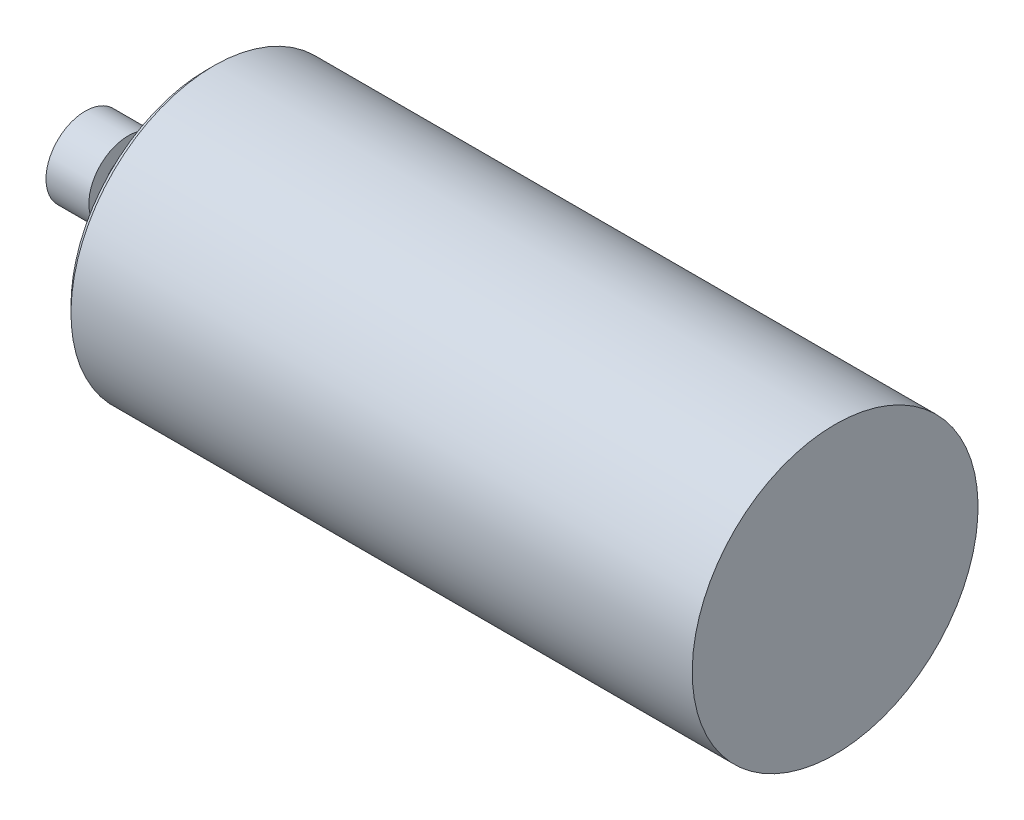
ISO-10303-21;
HEADER;
FILE_DESCRIPTION(('STEP AP214'),'2;1');
FILE_NAME('part.step','',(''),(''),'','','');
FILE_SCHEMA(('AUTOMOTIVE_DESIGN { 1 0 10303 214 1 1 1 1 }'));
ENDSEC;
DATA;
#1=APPLICATION_CONTEXT('core data for automotive mechanical design processes');
#2=APPLICATION_PROTOCOL_DEFINITION('international standard','automotive_design',2000,#1);
#3=PRODUCT_CONTEXT('',#1,'mechanical');
#4=PRODUCT('Part','Part','',(#3));
#5=PRODUCT_RELATED_PRODUCT_CATEGORY('part','',(#4));
#6=PRODUCT_DEFINITION_FORMATION('','',#4);
#7=PRODUCT_DEFINITION_CONTEXT('part definition',#1,'design');
#8=PRODUCT_DEFINITION('design','',#6,#7);
#9=PRODUCT_DEFINITION_SHAPE('','',#8);
#10=(LENGTH_UNIT() NAMED_UNIT(*) SI_UNIT(.MILLI.,.METRE.));
#11=(NAMED_UNIT(*) PLANE_ANGLE_UNIT() SI_UNIT($,.RADIAN.));
#12=(NAMED_UNIT(*) SI_UNIT($,.STERADIAN.) SOLID_ANGLE_UNIT());
#13=UNCERTAINTY_MEASURE_WITH_UNIT(LENGTH_MEASURE(1.E-05),#10,'distance_accuracy_value','');
#14=(GEOMETRIC_REPRESENTATION_CONTEXT(3) GLOBAL_UNCERTAINTY_ASSIGNED_CONTEXT((#13)) GLOBAL_UNIT_ASSIGNED_CONTEXT((#10,
#11,#12)) REPRESENTATION_CONTEXT('',''));
#15=CARTESIAN_POINT('',(0.,0.,0.));
#16=DIRECTION('',(0.,0.,1.));
#17=DIRECTION('',(1.,0.,0.));
#18=AXIS2_PLACEMENT_3D('',#15,#16,#17);
#19=CARTESIAN_POINT('',(278.635884666857,0.,0.));
#20=DIRECTION('',(-1.,0.,0.));
#21=DIRECTION('',(0.,-1.,0.));
#22=AXIS2_PLACEMENT_3D('',#19,#20,#21);
#23=PLANE('',#22);
#24=CARTESIAN_POINT('',(278.635884666857,0.,0.));
#25=DIRECTION('',(1.,0.,0.));
#26=DIRECTION('',(0.,1.,0.));
#27=AXIS2_PLACEMENT_3D('',#24,#25,#26);
#28=CIRCLE('',#27,40.);
#29=CARTESIAN_POINT('',(278.635884666857,40.,0.));
#30=VERTEX_POINT('',#29);
#31=EDGE_CURVE('E10',#30,#30,#28,.T.);
#32=ORIENTED_EDGE('',*,*,#31,.T.);
#33=EDGE_LOOP('',(#32));
#34=FACE_BOUND('',#33,.T.);
#35=ADVANCED_FACE('F30',(#34),#23,.F.);
#36=CARTESIAN_POINT('',(278.635884666857,0.,0.));
#37=DIRECTION('',(1.,0.,0.));
#38=DIRECTION('',(0.,1.,0.));
#39=AXIS2_PLACEMENT_3D('',#36,#37,#38);
#40=CYLINDRICAL_SURFACE('',#39,40.);
#41=ORIENTED_EDGE('',*,*,#31,.F.);
#42=EDGE_LOOP('',(#41));
#43=FACE_BOUND('',#42,.T.);
#44=CARTESIAN_POINT('',(104.753503300776,0.,0.));
#45=DIRECTION('',(1.,0.,0.));
#46=DIRECTION('',(0.,1.,0.));
#47=AXIS2_PLACEMENT_3D('',#44,#45,#46);
#48=CIRCLE('',#47,40.);
#49=CARTESIAN_POINT('',(104.753503300776,40.,0.));
#50=VERTEX_POINT('',#49);
#51=EDGE_CURVE('E36',#50,#50,#48,.T.);
#52=ORIENTED_EDGE('',*,*,#51,.T.);
#53=EDGE_LOOP('',(#52));
#54=FACE_BOUND('',#53,.T.);
#55=ADVANCED_FACE('F83',(#43,#54),#40,.T.);
#56=CARTESIAN_POINT('',(104.753503300776,-38.,0.));
#57=DIRECTION('',(1.,0.,0.));
#58=DIRECTION('',(0.,1.,0.));
#59=AXIS2_PLACEMENT_3D('',#56,#57,#58);
#60=PLANE('',#59);
#61=ORIENTED_EDGE('',*,*,#51,.F.);
#62=EDGE_LOOP('',(#61));
#63=FACE_BOUND('',#62,.T.);
#64=CARTESIAN_POINT('',(104.753503300776,0.,0.));
#65=DIRECTION('',(1.,0.,0.));
#66=DIRECTION('',(0.,1.,0.));
#67=AXIS2_PLACEMENT_3D('',#64,#65,#66);
#68=CIRCLE('',#67,38.);
#69=CARTESIAN_POINT('',(104.753503300776,38.0000000000001,0.));
#70=VERTEX_POINT('',#69);
#71=EDGE_CURVE('E40',#70,#70,#68,.T.);
#72=ORIENTED_EDGE('',*,*,#71,.T.);
#73=EDGE_LOOP('',(#72));
#74=FACE_BOUND('',#73,.T.);
#75=ADVANCED_FACE('F87',(#63,#74),#60,.F.);
#76=CARTESIAN_POINT('',(278.635884666857,0.,0.));
#77=DIRECTION('',(1.,0.,0.));
#78=DIRECTION('',(0.,1.,0.));
#79=AXIS2_PLACEMENT_3D('',#76,#77,#78);
#80=CYLINDRICAL_SURFACE('',#79,38.);
#81=ORIENTED_EDGE('',*,*,#71,.F.);
#82=EDGE_LOOP('',(#81));
#83=FACE_BOUND('',#82,.T.);
#84=CARTESIAN_POINT('',(102.753503300776,0.,0.));
#85=DIRECTION('',(1.,0.,0.));
#86=DIRECTION('',(0.,1.,0.));
#87=AXIS2_PLACEMENT_3D('',#84,#85,#86);
#88=CIRCLE('',#87,38.);
#89=CARTESIAN_POINT('',(102.753503300776,38.0000000000001,0.));
#90=VERTEX_POINT('',#89);
#91=EDGE_CURVE('E44',#90,#90,#88,.T.);
#92=ORIENTED_EDGE('',*,*,#91,.T.);
#93=EDGE_LOOP('',(#92));
#94=FACE_BOUND('',#93,.T.);
#95=ADVANCED_FACE('F92',(#83,#94),#80,.T.);
#96=CARTESIAN_POINT('',(98.7535033007764,0.,0.));
#97=DIRECTION('',(1.,0.,0.));
#98=DIRECTION('',(0.,1.,0.));
#99=AXIS2_PLACEMENT_3D('',#96,#97,#98);
#100=CONICAL_SURFACE('',#99,26.,1.24904577239825);
#101=ORIENTED_EDGE('',*,*,#91,.F.);
#102=EDGE_LOOP('',(#101));
#103=FACE_BOUND('',#102,.T.);
#104=CARTESIAN_POINT('',(98.7535033007764,0.,0.));
#105=DIRECTION('',(1.,0.,0.));
#106=DIRECTION('',(0.,1.,0.));
#107=AXIS2_PLACEMENT_3D('',#104,#105,#106);
#108=CIRCLE('',#107,26.);
#109=CARTESIAN_POINT('',(98.7535033007764,26.0000000000001,0.));
#110=VERTEX_POINT('',#109);
#111=EDGE_CURVE('E49',#110,#110,#108,.T.);
#112=ORIENTED_EDGE('',*,*,#111,.T.);
#113=EDGE_LOOP('',(#112));
#114=FACE_BOUND('',#113,.T.);
#115=ADVANCED_FACE('F98',(#103,#114),#100,.T.);
#116=CARTESIAN_POINT('',(98.7535033007764,-26.,0.));
#117=DIRECTION('',(1.,0.,0.));
#118=DIRECTION('',(0.,1.,0.));
#119=AXIS2_PLACEMENT_3D('',#116,#117,#118);
#120=PLANE('',#119);
#121=ORIENTED_EDGE('',*,*,#111,.F.);
#122=EDGE_LOOP('',(#121));
#123=FACE_BOUND('',#122,.T.);
#124=CARTESIAN_POINT('',(98.7535033007764,0.,0.));
#125=DIRECTION('',(1.,0.,0.));
#126=DIRECTION('',(0.,1.,0.));
#127=AXIS2_PLACEMENT_3D('',#124,#125,#126);
#128=CIRCLE('',#127,17.5);
#129=CARTESIAN_POINT('',(98.7535033007764,17.5000000000001,0.));
#130=VERTEX_POINT('',#129);
#131=EDGE_CURVE('E52',#130,#130,#128,.T.);
#132=ORIENTED_EDGE('',*,*,#131,.T.);
#133=EDGE_LOOP('',(#132));
#134=FACE_BOUND('',#133,.T.);
#135=ADVANCED_FACE('F102',(#123,#134),#120,.F.);
#136=CARTESIAN_POINT('',(278.635884666857,0.,0.));
#137=DIRECTION('',(1.,0.,0.));
#138=DIRECTION('',(0.,1.,0.));
#139=AXIS2_PLACEMENT_3D('',#136,#137,#138);
#140=CYLINDRICAL_SURFACE('',#139,17.5);
#141=ORIENTED_EDGE('',*,*,#131,.F.);
#142=EDGE_LOOP('',(#141));
#143=FACE_BOUND('',#142,.T.);
#144=CARTESIAN_POINT('',(93.7535033007764,0.,0.));
#145=DIRECTION('',(1.,0.,0.));
#146=DIRECTION('',(0.,1.,0.));
#147=AXIS2_PLACEMENT_3D('',#144,#145,#146);
#148=CIRCLE('',#147,17.5);
#149=CARTESIAN_POINT('',(93.7535033007764,17.5000000000001,0.));
#150=VERTEX_POINT('',#149);
#151=EDGE_CURVE('E55',#150,#150,#148,.T.);
#152=ORIENTED_EDGE('',*,*,#151,.T.);
#153=EDGE_LOOP('',(#152));
#154=FACE_BOUND('',#153,.T.);
#155=ADVANCED_FACE('F106',(#143,#154),#140,.T.);
#156=CARTESIAN_POINT('',(93.7535033007764,-17.5,0.));
#157=DIRECTION('',(1.,0.,0.));
#158=DIRECTION('',(0.,1.,0.));
#159=AXIS2_PLACEMENT_3D('',#156,#157,#158);
#160=PLANE('',#159);
#161=ORIENTED_EDGE('',*,*,#151,.F.);
#162=EDGE_LOOP('',(#161));
#163=FACE_BOUND('',#162,.T.);
#164=CARTESIAN_POINT('',(93.7535033007764,0.,0.));
#165=DIRECTION('',(1.,0.,0.));
#166=DIRECTION('',(0.,1.,0.));
#167=AXIS2_PLACEMENT_3D('',#164,#165,#166);
#168=CIRCLE('',#167,7.);
#169=CARTESIAN_POINT('',(93.7535033007764,7.00000000000002,0.));
#170=VERTEX_POINT('',#169);
#171=EDGE_CURVE('E58',#170,#170,#168,.T.);
#172=ORIENTED_EDGE('',*,*,#171,.T.);
#173=EDGE_LOOP('',(#172));
#174=FACE_BOUND('',#173,.T.);
#175=ADVANCED_FACE('F110',(#163,#174),#160,.F.);
#176=CARTESIAN_POINT('',(278.635884666857,0.,0.));
#177=DIRECTION('',(1.,0.,0.));
#178=DIRECTION('',(0.,1.,0.));
#179=AXIS2_PLACEMENT_3D('',#176,#177,#178);
#180=CYLINDRICAL_SURFACE('',#179,7.);
#181=ORIENTED_EDGE('',*,*,#171,.F.);
#182=EDGE_LOOP('',(#181));
#183=FACE_BOUND('',#182,.T.);
#184=CARTESIAN_POINT('',(80.7535033007764,0.,0.));
#185=DIRECTION('',(1.,0.,0.));
#186=DIRECTION('',(0.,1.,0.));
#187=AXIS2_PLACEMENT_3D('',#184,#185,#186);
#188=CIRCLE('',#187,7.);
#189=CARTESIAN_POINT('',(80.7535033007764,7.00000000000003,0.));
#190=VERTEX_POINT('',#189);
#191=EDGE_CURVE('E61',#190,#190,#188,.T.);
#192=ORIENTED_EDGE('',*,*,#191,.T.);
#193=EDGE_LOOP('',(#192));
#194=FACE_BOUND('',#193,.T.);
#195=ADVANCED_FACE('F114',(#183,#194),#180,.T.);
#196=CARTESIAN_POINT('',(80.7535033007764,-6.99999999999997,0.));
#197=DIRECTION('',(-1.,0.,0.));
#198=DIRECTION('',(0.,-1.,0.));
#199=AXIS2_PLACEMENT_3D('',#196,#197,#198);
#200=PLANE('',#199);
#201=ORIENTED_EDGE('',*,*,#191,.F.);
#202=EDGE_LOOP('',(#201));
#203=FACE_BOUND('',#202,.T.);
#204=CARTESIAN_POINT('',(80.7535033007764,0.,0.));
#205=DIRECTION('',(1.,0.,0.));
#206=DIRECTION('',(0.,1.,0.));
#207=AXIS2_PLACEMENT_3D('',#204,#205,#206);
#208=CIRCLE('',#207,10.9973511339876);
#209=CARTESIAN_POINT('',(80.7535033007764,10.9973511339876,0.));
#210=VERTEX_POINT('',#209);
#211=EDGE_CURVE('E64',#210,#210,#208,.T.);
#212=ORIENTED_EDGE('',*,*,#211,.T.);
#213=EDGE_LOOP('',(#212));
#214=FACE_BOUND('',#213,.T.);
#215=ADVANCED_FACE('F79',(#203,#214),#200,.F.);
#216=CARTESIAN_POINT('',(278.635884666857,0.,0.));
#217=DIRECTION('',(1.,0.,0.));
#218=DIRECTION('',(0.,1.,0.));
#219=AXIS2_PLACEMENT_3D('',#216,#217,#218);
#220=CYLINDRICAL_SURFACE('',#219,10.9973511339876);
#221=ORIENTED_EDGE('',*,*,#211,.F.);
#222=EDGE_LOOP('',(#221));
#223=FACE_BOUND('',#222,.T.);
#224=CARTESIAN_POINT('',(68.7535033007765,0.,0.));
#225=DIRECTION('',(1.,0.,0.));
#226=DIRECTION('',(0.,1.,0.));
#227=AXIS2_PLACEMENT_3D('',#224,#225,#226);
#228=CIRCLE('',#227,10.9973511339876);
#229=CARTESIAN_POINT('',(68.7535033007765,10.9973511339876,0.));
#230=VERTEX_POINT('',#229);
#231=EDGE_CURVE('E67',#230,#230,#228,.T.);
#232=ORIENTED_EDGE('',*,*,#231,.T.);
#233=EDGE_LOOP('',(#232));
#234=FACE_BOUND('',#233,.T.);
#235=ADVANCED_FACE('F71',(#223,#234),#220,.T.);
#236=CARTESIAN_POINT('',(68.7535033007764,-10.9973511339876,0.));
#237=DIRECTION('',(1.,0.,0.));
#238=DIRECTION('',(0.,1.,0.));
#239=AXIS2_PLACEMENT_3D('',#236,#237,#238);
#240=PLANE('',#239);
#241=ORIENTED_EDGE('',*,*,#231,.F.);
#242=EDGE_LOOP('',(#241));
#243=FACE_BOUND('',#242,.T.);
#244=ADVANCED_FACE('F73',(#243),#240,.F.);
#245=CLOSED_SHELL('',(#35,#55,#75,#95,#115,#135,#155,#175,#195,#215,#235,#244));
#246=MANIFOLD_SOLID_BREP('B2',#245);
#247=ADVANCED_BREP_SHAPE_REPRESENTATION('',(#18,#246),#14);
#248=SHAPE_DEFINITION_REPRESENTATION(#9,#247);
ENDSEC;
END-ISO-10303-21;
